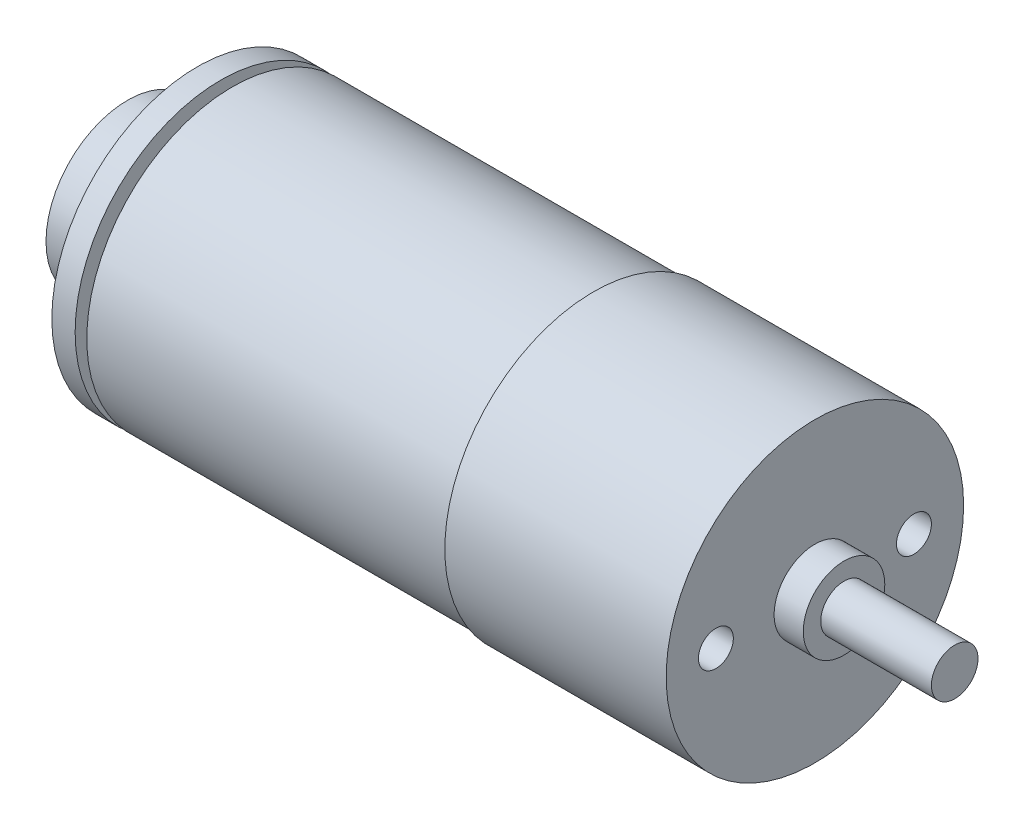
ISO-10303-21;
HEADER;
FILE_DESCRIPTION(('STEP AP214'),'2;1');
FILE_NAME('part.step','',(''),(''),'','','');
FILE_SCHEMA(('AUTOMOTIVE_DESIGN { 1 0 10303 214 1 1 1 1 }'));
ENDSEC;
DATA;
#1=APPLICATION_CONTEXT('core data for automotive mechanical design processes');
#2=APPLICATION_PROTOCOL_DEFINITION('international standard','automotive_design',2000,#1);
#3=PRODUCT_CONTEXT('',#1,'mechanical');
#4=PRODUCT('Part','Part','',(#3));
#5=PRODUCT_RELATED_PRODUCT_CATEGORY('part','',(#4));
#6=PRODUCT_DEFINITION_FORMATION('','',#4);
#7=PRODUCT_DEFINITION_CONTEXT('part definition',#1,'design');
#8=PRODUCT_DEFINITION('design','',#6,#7);
#9=PRODUCT_DEFINITION_SHAPE('','',#8);
#10=(LENGTH_UNIT() NAMED_UNIT(*) SI_UNIT(.MILLI.,.METRE.));
#11=(NAMED_UNIT(*) PLANE_ANGLE_UNIT() SI_UNIT($,.RADIAN.));
#12=(NAMED_UNIT(*) SI_UNIT($,.STERADIAN.) SOLID_ANGLE_UNIT());
#13=UNCERTAINTY_MEASURE_WITH_UNIT(LENGTH_MEASURE(1.E-05),#10,'distance_accuracy_value','');
#14=(GEOMETRIC_REPRESENTATION_CONTEXT(3) GLOBAL_UNCERTAINTY_ASSIGNED_CONTEXT((#13)) GLOBAL_UNIT_ASSIGNED_CONTEXT((#10,
#11,#12)) REPRESENTATION_CONTEXT('',''));
#15=CARTESIAN_POINT('',(0.,0.,0.));
#16=DIRECTION('',(0.,0.,1.));
#17=DIRECTION('',(1.,0.,0.));
#18=AXIS2_PLACEMENT_3D('',#15,#16,#17);
#19=CARTESIAN_POINT('',(1.,0.,0.));
#20=DIRECTION('',(-1.,0.,0.));
#21=DIRECTION('',(0.,0.,1.));
#22=AXIS2_PLACEMENT_3D('',#19,#20,#21);
#23=CYLINDRICAL_SURFACE('',#22,1.57987002541227);
#24=CARTESIAN_POINT('',(0.,0.,0.));
#25=DIRECTION('',(1.,0.,0.));
#26=DIRECTION('',(0.,0.,-1.));
#27=AXIS2_PLACEMENT_3D('',#24,#25,#26);
#28=CIRCLE('',#27,1.57987002541227);
#29=CARTESIAN_POINT('',(0.,0.,-1.57987002541227));
#30=VERTEX_POINT('',#29);
#31=EDGE_CURVE('E52',#30,#30,#28,.T.);
#32=ORIENTED_EDGE('',*,*,#31,.F.);
#33=EDGE_LOOP('',(#32));
#34=FACE_BOUND('',#33,.T.);
#35=CARTESIAN_POINT('',(-1.,0.,0.));
#36=DIRECTION('',(-1.,0.,0.));
#37=DIRECTION('',(0.,0.,1.));
#38=AXIS2_PLACEMENT_3D('',#35,#36,#37);
#39=CIRCLE('',#38,1.57987002541227);
#40=CARTESIAN_POINT('',(-1.,0.,1.57987002541227));
#41=VERTEX_POINT('',#40);
#42=EDGE_CURVE('E38',#41,#41,#39,.F.);
#43=ORIENTED_EDGE('',*,*,#42,.T.);
#44=EDGE_LOOP('',(#43));
#45=FACE_BOUND('',#44,.T.);
#46=ADVANCED_FACE('F34',(#34,#45),#23,.T.);
#47=CARTESIAN_POINT('',(31.,0.,0.));
#48=DIRECTION('',(-1.,0.,0.));
#49=DIRECTION('',(0.,0.,1.));
#50=AXIS2_PLACEMENT_3D('',#47,#48,#49);
#51=CYLINDRICAL_SURFACE('',#50,12.5);
#52=CARTESIAN_POINT('',(31.,0.,0.));
#53=DIRECTION('',(1.,0.,0.));
#54=DIRECTION('',(0.,0.,-1.));
#55=AXIS2_PLACEMENT_3D('',#52,#53,#54);
#56=CIRCLE('',#55,12.5);
#57=CARTESIAN_POINT('',(31.,0.,-12.5));
#58=VERTEX_POINT('',#57);
#59=EDGE_CURVE('E10',#58,#58,#56,.T.);
#60=ORIENTED_EDGE('',*,*,#59,.F.);
#61=EDGE_LOOP('',(#60));
#62=FACE_BOUND('',#61,.T.);
#63=CARTESIAN_POINT('',(0.,0.,0.));
#64=DIRECTION('',(1.,0.,0.));
#65=DIRECTION('',(0.,0.,-1.));
#66=AXIS2_PLACEMENT_3D('',#63,#64,#65);
#67=CIRCLE('',#66,12.5);
#68=CARTESIAN_POINT('',(0.,0.,-12.5));
#69=VERTEX_POINT('',#68);
#70=EDGE_CURVE('E42',#69,#69,#67,.T.);
#71=ORIENTED_EDGE('',*,*,#70,.T.);
#72=EDGE_LOOP('',(#71));
#73=FACE_BOUND('',#72,.T.);
#74=ADVANCED_FACE('F36',(#62,#73),#51,.T.);
#75=CARTESIAN_POINT('',(0.,0.,0.));
#76=DIRECTION('',(1.,0.,0.));
#77=DIRECTION('',(0.,0.,-1.));
#78=AXIS2_PLACEMENT_3D('',#75,#76,#77);
#79=PLANE('',#78);
#80=ORIENTED_EDGE('',*,*,#31,.T.);
#81=EDGE_LOOP('',(#80));
#82=FACE_BOUND('',#81,.T.);
#83=ORIENTED_EDGE('',*,*,#70,.F.);
#84=EDGE_LOOP('',(#83));
#85=FACE_BOUND('',#84,.T.);
#86=ADVANCED_FACE('F112',(#82,#85),#79,.F.);
#87=CARTESIAN_POINT('',(50.,0.,0.));
#88=DIRECTION('',(-1.,0.,0.));
#89=DIRECTION('',(0.,0.,1.));
#90=AXIS2_PLACEMENT_3D('',#87,#88,#89);
#91=CYLINDRICAL_SURFACE('',#90,12.7672585900072);
#92=CARTESIAN_POINT('',(50.,0.,0.));
#93=DIRECTION('',(1.,0.,0.));
#94=DIRECTION('',(0.,0.,-1.));
#95=AXIS2_PLACEMENT_3D('',#92,#93,#94);
#96=CIRCLE('',#95,12.7672585900072);
#97=CARTESIAN_POINT('',(50.,0.,-12.7672585900072));
#98=VERTEX_POINT('',#97);
#99=EDGE_CURVE('E47',#98,#98,#96,.T.);
#100=ORIENTED_EDGE('',*,*,#99,.F.);
#101=EDGE_LOOP('',(#100));
#102=FACE_BOUND('',#101,.T.);
#103=CARTESIAN_POINT('',(31.,0.,0.));
#104=DIRECTION('',(1.,0.,0.));
#105=DIRECTION('',(0.,0.,-1.));
#106=AXIS2_PLACEMENT_3D('',#103,#104,#105);
#107=CIRCLE('',#106,12.7672585900072);
#108=CARTESIAN_POINT('',(31.,0.,-12.7672585900072));
#109=VERTEX_POINT('',#108);
#110=EDGE_CURVE('E50',#109,#109,#107,.T.);
#111=ORIENTED_EDGE('',*,*,#110,.T.);
#112=EDGE_LOOP('',(#111));
#113=FACE_BOUND('',#112,.T.);
#114=ADVANCED_FACE('F89',(#102,#113),#91,.T.);
#115=CARTESIAN_POINT('',(50.,0.,0.));
#116=DIRECTION('',(1.,0.,0.));
#117=DIRECTION('',(0.,0.,-1.));
#118=AXIS2_PLACEMENT_3D('',#115,#116,#117);
#119=PLANE('',#118);
#120=CARTESIAN_POINT('',(50.,0.,8.5));
#121=DIRECTION('',(1.,0.,0.));
#122=DIRECTION('',(0.,0.,1.));
#123=AXIS2_PLACEMENT_3D('',#120,#121,#122);
#124=CIRCLE('',#123,1.5);
#125=CARTESIAN_POINT('',(50.,0.,10.));
#126=VERTEX_POINT('',#125);
#127=EDGE_CURVE('E293',#126,#126,#124,.T.);
#128=ORIENTED_EDGE('',*,*,#127,.F.);
#129=EDGE_LOOP('',(#128));
#130=FACE_BOUND('',#129,.T.);
#131=CARTESIAN_POINT('',(50.,0.,-8.5));
#132=DIRECTION('',(1.,0.,0.));
#133=DIRECTION('',(0.,0.,-1.));
#134=AXIS2_PLACEMENT_3D('',#131,#132,#133);
#135=CIRCLE('',#134,1.5);
#136=CARTESIAN_POINT('',(50.,0.,-10.));
#137=VERTEX_POINT('',#136);
#138=EDGE_CURVE('E292',#137,#137,#135,.T.);
#139=ORIENTED_EDGE('',*,*,#138,.F.);
#140=EDGE_LOOP('',(#139));
#141=FACE_BOUND('',#140,.T.);
#142=CARTESIAN_POINT('',(50.,0.,0.));
#143=DIRECTION('',(1.,0.,0.));
#144=DIRECTION('',(0.,0.,-1.));
#145=AXIS2_PLACEMENT_3D('',#142,#143,#144);
#146=CIRCLE('',#145,3.5);
#147=CARTESIAN_POINT('',(50.,0.,-3.5));
#148=VERTEX_POINT('',#147);
#149=EDGE_CURVE('E77',#148,#148,#146,.T.);
#150=ORIENTED_EDGE('',*,*,#149,.F.);
#151=EDGE_LOOP('',(#150));
#152=FACE_BOUND('',#151,.T.);
#153=ORIENTED_EDGE('',*,*,#99,.T.);
#154=EDGE_LOOP('',(#153));
#155=FACE_BOUND('',#154,.T.);
#156=ADVANCED_FACE('F94',(#130,#141,#152,#155),#119,.T.);
#157=CARTESIAN_POINT('',(31.,0.,0.));
#158=DIRECTION('',(1.,0.,0.));
#159=DIRECTION('',(0.,0.,-1.));
#160=AXIS2_PLACEMENT_3D('',#157,#158,#159);
#161=PLANE('',#160);
#162=ORIENTED_EDGE('',*,*,#59,.T.);
#163=EDGE_LOOP('',(#162));
#164=FACE_BOUND('',#163,.T.);
#165=ORIENTED_EDGE('',*,*,#110,.F.);
#166=EDGE_LOOP('',(#165));
#167=FACE_BOUND('',#166,.T.);
#168=ADVANCED_FACE('F91',(#164,#167),#161,.F.);
#169=CARTESIAN_POINT('',(52.5,0.,0.));
#170=DIRECTION('',(-1.,0.,0.));
#171=DIRECTION('',(0.,0.,1.));
#172=AXIS2_PLACEMENT_3D('',#169,#170,#171);
#173=CYLINDRICAL_SURFACE('',#172,3.5);
#174=CARTESIAN_POINT('',(52.5,0.,0.));
#175=DIRECTION('',(1.,0.,0.));
#176=DIRECTION('',(0.,0.,-1.));
#177=AXIS2_PLACEMENT_3D('',#174,#175,#176);
#178=CIRCLE('',#177,3.5);
#179=CARTESIAN_POINT('',(52.5,0.,-3.5));
#180=VERTEX_POINT('',#179);
#181=EDGE_CURVE('E79',#180,#180,#178,.T.);
#182=ORIENTED_EDGE('',*,*,#181,.F.);
#183=EDGE_LOOP('',(#182));
#184=FACE_BOUND('',#183,.T.);
#185=ORIENTED_EDGE('',*,*,#149,.T.);
#186=EDGE_LOOP('',(#185));
#187=FACE_BOUND('',#186,.T.);
#188=ADVANCED_FACE('F93',(#184,#187),#173,.T.);
#189=CARTESIAN_POINT('',(52.5,0.,0.));
#190=DIRECTION('',(1.,0.,0.));
#191=DIRECTION('',(0.,0.,-1.));
#192=AXIS2_PLACEMENT_3D('',#189,#190,#191);
#193=PLANE('',#192);
#194=CARTESIAN_POINT('',(52.5,0.,0.));
#195=DIRECTION('',(1.,0.,0.));
#196=DIRECTION('',(0.,0.,-1.));
#197=AXIS2_PLACEMENT_3D('',#194,#195,#196);
#198=CIRCLE('',#197,2.);
#199=CARTESIAN_POINT('',(52.5,0.,-2.));
#200=VERTEX_POINT('',#199);
#201=EDGE_CURVE('E54',#200,#200,#198,.T.);
#202=ORIENTED_EDGE('',*,*,#201,.F.);
#203=EDGE_LOOP('',(#202));
#204=FACE_BOUND('',#203,.T.);
#205=ORIENTED_EDGE('',*,*,#181,.T.);
#206=EDGE_LOOP('',(#205));
#207=FACE_BOUND('',#206,.T.);
#208=ADVANCED_FACE('F100',(#204,#207),#193,.T.);
#209=CARTESIAN_POINT('',(62.,0.,0.));
#210=DIRECTION('',(-1.,0.,0.));
#211=DIRECTION('',(0.,0.,1.));
#212=AXIS2_PLACEMENT_3D('',#209,#210,#211);
#213=CYLINDRICAL_SURFACE('',#212,2.);
#214=CARTESIAN_POINT('',(62.,0.,0.));
#215=DIRECTION('',(1.,0.,0.));
#216=DIRECTION('',(0.,0.,-1.));
#217=AXIS2_PLACEMENT_3D('',#214,#215,#216);
#218=CIRCLE('',#217,2.);
#219=CARTESIAN_POINT('',(62.,0.,-2.));
#220=VERTEX_POINT('',#219);
#221=EDGE_CURVE('E58',#220,#220,#218,.T.);
#222=ORIENTED_EDGE('',*,*,#221,.F.);
#223=EDGE_LOOP('',(#222));
#224=FACE_BOUND('',#223,.T.);
#225=ORIENTED_EDGE('',*,*,#201,.T.);
#226=EDGE_LOOP('',(#225));
#227=FACE_BOUND('',#226,.T.);
#228=ADVANCED_FACE('F122',(#224,#227),#213,.T.);
#229=CARTESIAN_POINT('',(62.,0.,0.));
#230=DIRECTION('',(1.,0.,0.));
#231=DIRECTION('',(0.,0.,-1.));
#232=AXIS2_PLACEMENT_3D('',#229,#230,#231);
#233=PLANE('',#232);
#234=ORIENTED_EDGE('',*,*,#221,.T.);
#235=EDGE_LOOP('',(#234));
#236=FACE_BOUND('',#235,.T.);
#237=ADVANCED_FACE('F118',(#236),#233,.T.);
#238=CARTESIAN_POINT('',(-3.,0.,0.));
#239=DIRECTION('',(1.,0.,0.));
#240=DIRECTION('',(0.,0.,-1.));
#241=AXIS2_PLACEMENT_3D('',#238,#239,#240);
#242=CYLINDRICAL_SURFACE('',#241,12.5);
#243=CARTESIAN_POINT('',(-3.,0.,0.));
#244=DIRECTION('',(-1.,0.,0.));
#245=DIRECTION('',(0.,0.,1.));
#246=AXIS2_PLACEMENT_3D('',#243,#244,#245);
#247=CIRCLE('',#246,12.5);
#248=CARTESIAN_POINT('',(-3.,0.,12.5));
#249=VERTEX_POINT('',#248);
#250=EDGE_CURVE('E61',#249,#249,#247,.T.);
#251=ORIENTED_EDGE('',*,*,#250,.F.);
#252=EDGE_LOOP('',(#251));
#253=FACE_BOUND('',#252,.T.);
#254=CARTESIAN_POINT('',(-1.,0.,0.));
#255=DIRECTION('',(-1.,0.,0.));
#256=DIRECTION('',(0.,0.,1.));
#257=AXIS2_PLACEMENT_3D('',#254,#255,#256);
#258=CIRCLE('',#257,12.5);
#259=CARTESIAN_POINT('',(-1.,0.,12.5));
#260=VERTEX_POINT('',#259);
#261=EDGE_CURVE('E65',#260,#260,#258,.T.);
#262=ORIENTED_EDGE('',*,*,#261,.T.);
#263=EDGE_LOOP('',(#262));
#264=FACE_BOUND('',#263,.T.);
#265=ADVANCED_FACE('F121',(#253,#264),#242,.T.);
#266=CARTESIAN_POINT('',(-1.,0.,0.));
#267=DIRECTION('',(-1.,0.,0.));
#268=DIRECTION('',(0.,0.,1.));
#269=AXIS2_PLACEMENT_3D('',#266,#267,#268);
#270=PLANE('',#269);
#271=ORIENTED_EDGE('',*,*,#42,.F.);
#272=EDGE_LOOP('',(#271));
#273=FACE_BOUND('',#272,.T.);
#274=ORIENTED_EDGE('',*,*,#261,.F.);
#275=EDGE_LOOP('',(#274));
#276=FACE_BOUND('',#275,.T.);
#277=ADVANCED_FACE('F154',(#273,#276),#270,.F.);
#278=CARTESIAN_POINT('',(-3.,0.,0.));
#279=DIRECTION('',(-1.,0.,0.));
#280=DIRECTION('',(0.,0.,1.));
#281=AXIS2_PLACEMENT_3D('',#278,#279,#280);
#282=PLANE('',#281);
#283=CARTESIAN_POINT('',(-3.,0.,0.));
#284=DIRECTION('',(-1.,0.,0.));
#285=DIRECTION('',(0.,0.,1.));
#286=AXIS2_PLACEMENT_3D('',#283,#284,#285);
#287=CIRCLE('',#286,7.);
#288=CARTESIAN_POINT('',(-3.,0.,7.));
#289=VERTEX_POINT('',#288);
#290=EDGE_CURVE('E73',#289,#289,#287,.T.);
#291=ORIENTED_EDGE('',*,*,#290,.F.);
#292=EDGE_LOOP('',(#291));
#293=FACE_BOUND('',#292,.T.);
#294=ORIENTED_EDGE('',*,*,#250,.T.);
#295=EDGE_LOOP('',(#294));
#296=FACE_BOUND('',#295,.T.);
#297=ADVANCED_FACE('F116',(#293,#296),#282,.T.);
#298=CARTESIAN_POINT('',(-9.,0.,0.));
#299=DIRECTION('',(1.,0.,0.));
#300=DIRECTION('',(0.,0.,-1.));
#301=AXIS2_PLACEMENT_3D('',#298,#299,#300);
#302=CYLINDRICAL_SURFACE('',#301,7.);
#303=CARTESIAN_POINT('',(-9.,0.,0.));
#304=DIRECTION('',(-1.,0.,0.));
#305=DIRECTION('',(0.,0.,1.));
#306=AXIS2_PLACEMENT_3D('',#303,#304,#305);
#307=CIRCLE('',#306,7.);
#308=CARTESIAN_POINT('',(-9.,0.,7.));
#309=VERTEX_POINT('',#308);
#310=EDGE_CURVE('E70',#309,#309,#307,.T.);
#311=ORIENTED_EDGE('',*,*,#310,.F.);
#312=EDGE_LOOP('',(#311));
#313=FACE_BOUND('',#312,.T.);
#314=ORIENTED_EDGE('',*,*,#290,.T.);
#315=EDGE_LOOP('',(#314));
#316=FACE_BOUND('',#315,.T.);
#317=ADVANCED_FACE('F169',(#313,#316),#302,.T.);
#318=CARTESIAN_POINT('',(-9.,0.,0.));
#319=DIRECTION('',(-1.,0.,0.));
#320=DIRECTION('',(0.,0.,1.));
#321=AXIS2_PLACEMENT_3D('',#318,#319,#320);
#322=PLANE('',#321);
#323=ORIENTED_EDGE('',*,*,#310,.T.);
#324=EDGE_LOOP('',(#323));
#325=FACE_BOUND('',#324,.T.);
#326=ADVANCED_FACE('F176',(#325),#322,.T.);
#327=CARTESIAN_POINT('',(47.,0.,-8.5));
#328=DIRECTION('',(1.,0.,0.));
#329=DIRECTION('',(0.,0.,-1.));
#330=AXIS2_PLACEMENT_3D('',#327,#328,#329);
#331=CYLINDRICAL_SURFACE('',#330,1.5);
#332=CARTESIAN_POINT('',(47.,0.,-8.5));
#333=DIRECTION('',(1.,0.,0.));
#334=DIRECTION('',(0.,0.,-1.));
#335=AXIS2_PLACEMENT_3D('',#332,#333,#334);
#336=CIRCLE('',#335,1.5);
#337=CARTESIAN_POINT('',(47.,0.,-10.));
#338=VERTEX_POINT('',#337);
#339=EDGE_CURVE('E296',#338,#338,#336,.T.);
#340=ORIENTED_EDGE('',*,*,#339,.F.);
#341=EDGE_LOOP('',(#340));
#342=FACE_BOUND('',#341,.T.);
#343=ORIENTED_EDGE('',*,*,#138,.T.);
#344=EDGE_LOOP('',(#343));
#345=FACE_BOUND('',#344,.T.);
#346=ADVANCED_FACE('F184',(#342,#345),#331,.F.);
#347=CARTESIAN_POINT('',(47.,0.,-8.5));
#348=DIRECTION('',(1.,0.,0.));
#349=DIRECTION('',(0.,0.,-1.));
#350=AXIS2_PLACEMENT_3D('',#347,#348,#349);
#351=PLANE('',#350);
#352=ORIENTED_EDGE('',*,*,#339,.T.);
#353=EDGE_LOOP('',(#352));
#354=FACE_BOUND('',#353,.T.);
#355=ADVANCED_FACE('F193',(#354),#351,.T.);
#356=CARTESIAN_POINT('',(47.,0.,8.5));
#357=DIRECTION('',(1.,0.,0.));
#358=DIRECTION('',(0.,0.,-1.));
#359=AXIS2_PLACEMENT_3D('',#356,#357,#358);
#360=CYLINDRICAL_SURFACE('',#359,1.5);
#361=CARTESIAN_POINT('',(47.,0.,8.5));
#362=DIRECTION('',(1.,0.,0.));
#363=DIRECTION('',(0.,0.,1.));
#364=AXIS2_PLACEMENT_3D('',#361,#362,#363);
#365=CIRCLE('',#364,1.5);
#366=CARTESIAN_POINT('',(47.,0.,10.));
#367=VERTEX_POINT('',#366);
#368=EDGE_CURVE('E291',#367,#367,#365,.T.);
#369=ORIENTED_EDGE('',*,*,#368,.F.);
#370=EDGE_LOOP('',(#369));
#371=FACE_BOUND('',#370,.T.);
#372=ORIENTED_EDGE('',*,*,#127,.T.);
#373=EDGE_LOOP('',(#372));
#374=FACE_BOUND('',#373,.T.);
#375=ADVANCED_FACE('F201',(#371,#374),#360,.F.);
#376=CARTESIAN_POINT('',(47.,0.,8.5));
#377=DIRECTION('',(-1.,0.,0.));
#378=DIRECTION('',(0.,0.,1.));
#379=AXIS2_PLACEMENT_3D('',#376,#377,#378);
#380=PLANE('',#379);
#381=ORIENTED_EDGE('',*,*,#368,.T.);
#382=EDGE_LOOP('',(#381));
#383=FACE_BOUND('',#382,.T.);
#384=ADVANCED_FACE('F209',(#383),#380,.F.);
#385=CLOSED_SHELL('',(#46,#74,#86,#114,#156,#168,#188,#208,#228,#237,#265,#277,#297,#317,#326,
#346,#355,#375,#384));
#386=MANIFOLD_SOLID_BREP('B2',#385);
#387=ADVANCED_BREP_SHAPE_REPRESENTATION('',(#18,#386),#14);
#388=SHAPE_DEFINITION_REPRESENTATION(#9,#387);
ENDSEC;
END-ISO-10303-21;
